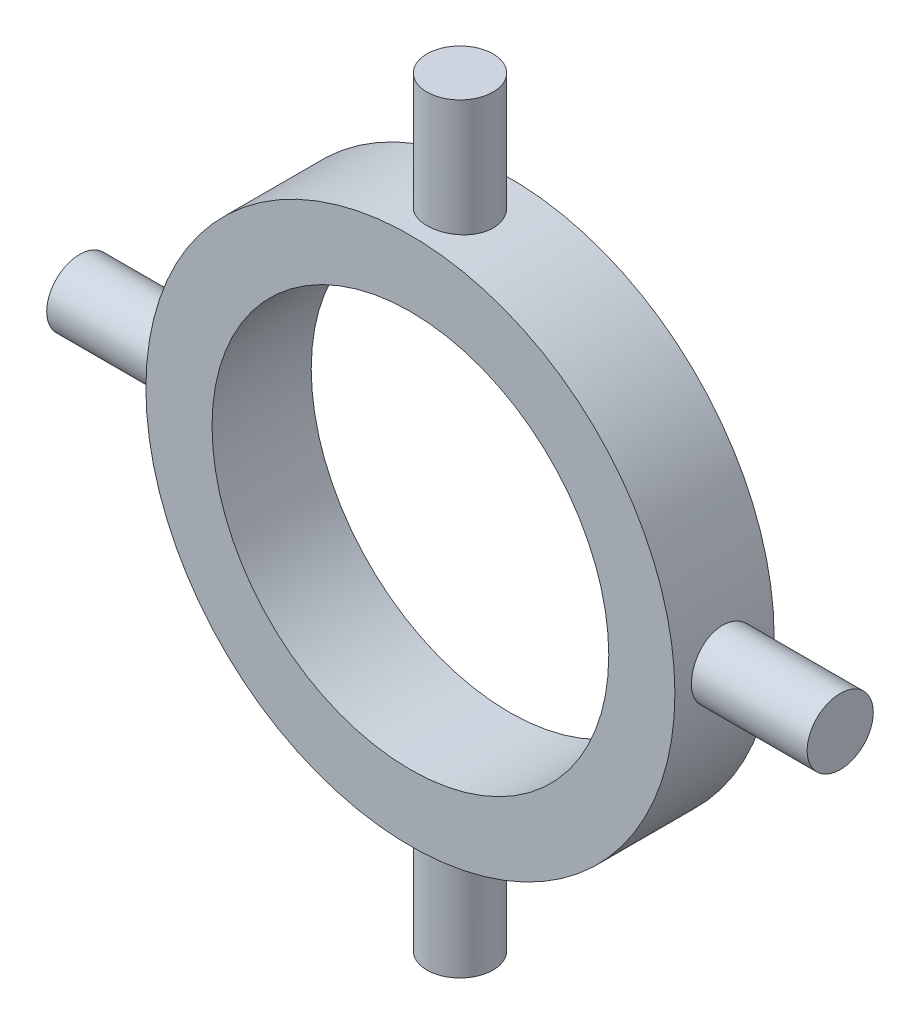
ISO-10303-21;
HEADER;
FILE_DESCRIPTION(('STEP AP214'),'2;1');
FILE_NAME('part.step','',(''),(''),'','','');
FILE_SCHEMA(('AUTOMOTIVE_DESIGN { 1 0 10303 214 1 1 1 1 }'));
ENDSEC;
DATA;
#1=APPLICATION_CONTEXT('core data for automotive mechanical design processes');
#2=APPLICATION_PROTOCOL_DEFINITION('international standard','automotive_design',2000,#1);
#3=PRODUCT_CONTEXT('',#1,'mechanical');
#4=PRODUCT('Part','Part','',(#3));
#5=PRODUCT_RELATED_PRODUCT_CATEGORY('part','',(#4));
#6=PRODUCT_DEFINITION_FORMATION('','',#4);
#7=PRODUCT_DEFINITION_CONTEXT('part definition',#1,'design');
#8=PRODUCT_DEFINITION('design','',#6,#7);
#9=PRODUCT_DEFINITION_SHAPE('','',#8);
#10=(LENGTH_UNIT() NAMED_UNIT(*) SI_UNIT(.MILLI.,.METRE.));
#11=(NAMED_UNIT(*) PLANE_ANGLE_UNIT() SI_UNIT($,.RADIAN.));
#12=(NAMED_UNIT(*) SI_UNIT($,.STERADIAN.) SOLID_ANGLE_UNIT());
#13=UNCERTAINTY_MEASURE_WITH_UNIT(LENGTH_MEASURE(1.E-05),#10,'distance_accuracy_value','');
#14=(GEOMETRIC_REPRESENTATION_CONTEXT(3) GLOBAL_UNCERTAINTY_ASSIGNED_CONTEXT((#13)) GLOBAL_UNIT_ASSIGNED_CONTEXT((#10,
#11,#12)) REPRESENTATION_CONTEXT('',''));
#15=CARTESIAN_POINT('',(0.,0.,0.));
#16=DIRECTION('',(0.,0.,1.));
#17=DIRECTION('',(1.,0.,0.));
#18=AXIS2_PLACEMENT_3D('',#15,#16,#17);
#19=CARTESIAN_POINT('',(0.,0.,7.5));
#20=DIRECTION('',(0.,0.,-1.));
#21=DIRECTION('',(-1.,0.,0.));
#22=AXIS2_PLACEMENT_3D('',#19,#20,#21);
#23=CYLINDRICAL_SURFACE('',#22,40.);
#24=CARTESIAN_POINT('',(40.,0.,5.));
#25=CARTESIAN_POINT('',(40.0000005381638,-0.139890119905128,5.00000160544363));
#26=CARTESIAN_POINT('',(39.9992647084955,-0.279756672055417,4.99412713053245));
#27=CARTESIAN_POINT('',(39.9963430990474,-0.558534146473231,4.97067434773429));
#28=CARTESIAN_POINT('',(39.9941569906199,-0.697444844924114,4.95309338703724));
#29=CARTESIAN_POINT('',(39.9883933720996,-0.973374569297787,4.90633674356431));
#30=CARTESIAN_POINT('',(39.984814825974,-1.11039210784,4.87715242704535));
#31=CARTESIAN_POINT('',(39.9763659190365,-1.3815095487987,4.80739331014042));
#32=CARTESIAN_POINT('',(39.9714950850908,-1.51560836311208,4.76681433761206));
#33=CARTESIAN_POINT('',(39.9606049872555,-1.77974867952927,4.67461680294956));
#34=CARTESIAN_POINT('',(39.9545869317721,-1.90979428479119,4.62300985008975));
#35=CARTESIAN_POINT('',(39.9415653040234,-2.16511159371551,4.50908421885045));
#36=CARTESIAN_POINT('',(39.9345613689602,-2.29038151829056,4.44676159528642));
#37=CARTESIAN_POINT('',(39.9197695937799,-2.53515746693697,4.31190117409457));
#38=CARTESIAN_POINT('',(39.9119821851605,-2.6546666106878,4.23936899068734));
#39=CARTESIAN_POINT('',(39.8958344174102,-2.8872111518514,4.0845478077838));
#40=CARTESIAN_POINT('',(39.8874738466497,-3.00024412947129,4.00225519615066));
#41=CARTESIAN_POINT('',(39.870376541653,-3.21950680684037,3.82811508199551));
#42=CARTESIAN_POINT('',(39.8616382696722,-3.32570323025801,3.73622582935142));
#43=CARTESIAN_POINT('',(39.8440638930874,-3.5300274197965,3.54381244367173));
#44=CARTESIAN_POINT('',(39.8352277534966,-3.62815218732704,3.44328512973081));
#45=CARTESIAN_POINT('',(39.8177127277211,-3.81557488779224,3.23435870872106));
#46=CARTESIAN_POINT('',(39.8090337926071,-3.90487560711768,3.12596210543272));
#47=CARTESIAN_POINT('',(39.7920724042628,-4.0740900049766,2.90198180305958));
#48=CARTESIAN_POINT('',(39.7837900984836,-4.15400020829435,2.78639546726841));
#49=CARTESIAN_POINT('',(39.767836590115,-4.30405460761974,2.54851867461022));
#50=CARTESIAN_POINT('',(39.7601672998988,-4.37416871629244,2.42620910452733));
#51=CARTESIAN_POINT('',(39.7456849515384,-4.50386359810217,2.17602320489505));
#52=CARTESIAN_POINT('',(39.7388722121988,-4.56344045265623,2.04814482636181));
#53=CARTESIAN_POINT('',(39.7263059358328,-4.6715723788149,1.7878085120806));
#54=CARTESIAN_POINT('',(39.7205519765303,-4.72013184632193,1.65535242721738));
#55=CARTESIAN_POINT('',(39.7102634489657,-4.80591459607029,1.38675855092581));
#56=CARTESIAN_POINT('',(39.7057293285926,-4.84313371513162,1.25061942733057));
#57=CARTESIAN_POINT('',(39.6942156965831,-4.9369446836796,0.839670275198614));
#58=CARTESIAN_POINT('',(39.689242054193,-4.97637915708478,0.560663990237947));
#59=CARTESIAN_POINT('',(39.6852781774936,-5.00788537091912,0.000104969119371298));
#60=CARTESIAN_POINT('',(39.6862877025679,-4.99995901599061,-0.281447664181033));
#61=CARTESIAN_POINT('',(39.6941397412189,-4.93723068067905,-0.837598360611085));
#62=CARTESIAN_POINT('',(39.7009489290566,-4.88269650974364,-1.11222694590207));
#63=CARTESIAN_POINT('',(39.7195838252991,-4.72870178261044,-1.64839306899775));
#64=CARTESIAN_POINT('',(39.7314096353432,-4.62924031615993,-1.90993034144568));
#65=CARTESIAN_POINT('',(39.7587823629902,-4.38793084641347,-2.41333518378111));
#66=CARTESIAN_POINT('',(39.7743394764765,-4.24596643413691,-2.65514638226273));
#67=CARTESIAN_POINT('',(39.8074142163638,-3.92376301219555,-3.11161360707172));
#68=CARTESIAN_POINT('',(39.8249319324209,-3.74352225186026,-3.32626839061148));
#69=CARTESIAN_POINT('',(39.8601022011236,-3.34839820167265,-3.72388536237577));
#70=CARTESIAN_POINT('',(39.8777548486259,-3.13328401036466,-3.90661816770982));
#71=CARTESIAN_POINT('',(39.9110926502289,-2.67531434354322,-4.23341777588328));
#72=CARTESIAN_POINT('',(39.9267777997928,-2.43245880406302,-4.3774844895628));
#73=CARTESIAN_POINT('',(39.954423044609,-1.92572334129996,-4.62286263670761));
#74=CARTESIAN_POINT('',(39.9663818880919,-1.66183639028543,-4.72415970671156));
#75=CARTESIAN_POINT('',(39.9852157155401,-1.12061588125209,-4.88094098809736));
#76=CARTESIAN_POINT('',(39.9920909375101,-0.843282953394362,-4.93642734425758));
#77=CARTESIAN_POINT('',(39.9999519282224,-0.285026327694849,-4.99971484853751));
#78=CARTESIAN_POINT('',(40.0009767228211,-0.00413898025519586,-5.00783198583042));
#79=CARTESIAN_POINT('',(39.9971267601402,0.554992072852983,-4.97698453078585));
#80=CARTESIAN_POINT('',(39.9922521284979,0.83323583469351,-4.93802094110426));
#81=CARTESIAN_POINT('',(39.9771753750007,1.37824901587752,-4.81438058682935));
#82=CARTESIAN_POINT('',(39.9669908157769,1.64505314244337,-4.72985448958341));
#83=CARTESIAN_POINT('',(39.9424344625044,2.16069930812281,-4.51764507978493));
#84=CARTESIAN_POINT('',(39.9280625262813,2.40954073698899,-4.38996030183751));
#85=CARTESIAN_POINT('',(39.8966364563238,2.88360904734714,-4.09429378648019));
#86=CARTESIAN_POINT('',(39.8795688738227,3.10870754222787,-3.92610765044467));
#87=CARTESIAN_POINT('',(39.8447028535409,3.52759395691152,-3.55450077486652));
#88=CARTESIAN_POINT('',(39.8269043867709,3.72138063328024,-3.35107863671943));
#89=CARTESIAN_POINT('',(39.7924620828694,4.07326400150426,-2.91338603015321));
#90=CARTESIAN_POINT('',(39.775825395705,4.23115123496745,-2.67894653919066));
#91=CARTESIAN_POINT('',(39.7457083194625,4.50530546506172,-2.18668027854392));
#92=CARTESIAN_POINT('',(39.7322278671136,4.62157329603301,-1.92885397782277));
#93=CARTESIAN_POINT('',(39.7099966403349,4.80885432607939,-1.39786139323798));
#94=CARTESIAN_POINT('',(39.7012335337284,4.87998560998222,-1.12473718803257));
#95=CARTESIAN_POINT('',(39.6893996880528,4.97533563287031,-0.570150186396651));
#96=CARTESIAN_POINT('',(39.686328684172,4.99955655425279,-0.288687778500497));
#97=CARTESIAN_POINT('',(39.686241386048,5.00021203982538,0.132294900316459));
#98=CARTESIAN_POINT('',(39.68695676783,4.99455342448889,0.272009225551819));
#99=CARTESIAN_POINT('',(39.6898435691377,4.97156759842692,0.550445504540787));
#100=CARTESIAN_POINT('',(39.6920144462689,4.95424473440731,0.68916780851851));
#101=CARTESIAN_POINT('',(39.6977533828976,4.90804527126818,0.964687038375647));
#102=CARTESIAN_POINT('',(39.7013219505368,4.87916447008386,1.1014832452479));
#103=CARTESIAN_POINT('',(39.7097514776595,4.81007786270748,1.3720937237412));
#104=CARTESIAN_POINT('',(39.7146119670106,4.76987617588932,1.50590906094575));
#105=CARTESIAN_POINT('',(39.7254873627674,4.67843682035607,1.76966440410947));
#106=CARTESIAN_POINT('',(39.731502265984,4.6271991821289,1.89960442077346));
#107=CARTESIAN_POINT('',(39.7445132115212,4.51407883701003,2.15465706308245));
#108=CARTESIAN_POINT('',(39.7515088975085,4.45219999438841,2.27977142100564));
#109=CARTESIAN_POINT('',(39.766288286481,4.3182008584531,2.5244006078898));
#110=CARTESIAN_POINT('',(39.7740722778211,4.24607681362515,2.64391336428205));
#111=CARTESIAN_POINT('',(39.7902044420045,4.09214062508192,2.87642448291324));
#112=CARTESIAN_POINT('',(39.7985524114375,4.01033196639699,2.98942516690357));
#113=CARTESIAN_POINT('',(39.8156417227917,3.83696646630907,3.20895432041371));
#114=CARTESIAN_POINT('',(39.8243854215878,3.74534501263952,3.31543158787401));
#115=CARTESIAN_POINT('',(39.8419606965952,3.55351080059086,3.52026178003775));
#116=CARTESIAN_POINT('',(39.8507922397986,3.45330116889781,3.61861763610109));
#117=CARTESIAN_POINT('',(39.8683029909288,3.24489676777311,3.80661935729718));
#118=CARTESIAN_POINT('',(39.8769821036513,3.13669721323718,3.8962599272414));
#119=CARTESIAN_POINT('',(39.8939349862933,2.91316118457661,4.06610237103271));
#120=CARTESIAN_POINT('',(39.9022089047575,2.79782736151177,4.14630771919458));
#121=CARTESIAN_POINT('',(39.9181553288822,2.56029300186372,4.29706521534259));
#122=CARTESIAN_POINT('',(39.925825172646,2.43806574742473,4.3675755588279));
#123=CARTESIAN_POINT('',(39.9403041894309,2.1880968873515,4.49801067551831));
#124=CARTESIAN_POINT('',(39.9471136779409,2.06035732624456,4.55793933220894));
#125=CARTESIAN_POINT('',(39.9596765836336,1.80032528471156,4.66676281985612));
#126=CARTESIAN_POINT('',(39.9654308239915,1.66803644956566,4.71566625822586));
#127=CARTESIAN_POINT('',(39.9757248289655,1.39980201837412,4.80212587715902));
#128=CARTESIAN_POINT('',(39.9802648800246,1.26385729314414,4.83968473432816));
#129=CARTESIAN_POINT('',(39.9893293227844,0.942088347754174,4.91409048578269));
#130=CARTESIAN_POINT('',(39.993314089932,0.755150897758069,4.94627339191876));
#131=CARTESIAN_POINT('',(39.9986490545576,0.378794555992436,4.9892269833987));
#132=CARTESIAN_POINT('',(39.999999271463,0.189375682531533,4.99999782663719));
#133=CARTESIAN_POINT('',(40.,0.,5.));
#134=B_SPLINE_CURVE_WITH_KNOTS('',3,(#24,#25,#26,#27,#28,#29,#30,#31,#32,#33,#34,#35,#36,#37,
#38,#39,#40,#41,#42,#43,#44,#45,#46,#47,#48,#49,#50,#51,#52,#53,#54,#55,#56,#57,#58,#59,#60,#61,
#62,#63,#64,#65,#66,#67,#68,#69,#70,#71,#72,#73,#74,#75,#76,#77,#78,#79,#80,#81,#82,#83,#84,#85,
#86,#87,#88,#89,#90,#91,#92,#93,#94,#95,#96,#97,#98,#99,#100,#101,#102,#103,#104,#105,#106,#107,
#108,#109,#110,#111,#112,#113,#114,#115,#116,#117,#118,#119,#120,#121,#122,#123,#124,#125,#126,
#127,#128,#129,#130,#131,#132,#133),.UNSPECIFIED.,.T.,.F.,(4,2,2,2,2,2,2,2,2,2,2,2,2,2,2,2,2,2,
2,2,2,2,2,2,2,2,2,2,2,2,2,2,2,2,2,2,2,2,2,2,2,2,2,2,2,2,2,2,2,2,2,2,2,2,4),(0.,
0.419504637823986,0.839104372080577,1.2590169051986,1.67908338982058,2.09870982539649,
2.51849108679867,2.93804240646985,3.35774948092479,3.77936522319641,4.20113689336971,
4.62277495120623,5.04456855951595,5.46763043530048,5.89084930960155,6.31389902278685,
6.73710385606696,7.57817257185724,8.4192074638241,9.25544199496467,10.0916934694557,
10.9302565918415,11.7688580764036,12.6132576288592,13.4576591283931,14.3023439807629,
15.1469892842064,15.9859936539693,16.8249801561694,17.6612091439987,18.4974665277098,
19.3380361246993,20.1786390936326,21.0240274962823,21.8693989505616,22.7125495517493,
23.5556609263433,23.9747450940195,24.3936731755013,24.8127537032622,25.2316819351986,
25.6506090098186,26.0693842743663,26.4883132802118,26.9070919891524,27.3288208308206,
27.7503967812448,28.1722272905917,28.5939019805889,29.0173414250536,29.4406251425127,
29.8635772481613,30.2864294856975,30.8543363757694,31.4222390780256),.UNSPECIFIED.);
#135=CARTESIAN_POINT('',(40.,0.,5.));
#136=VERTEX_POINT('',#135);
#137=EDGE_CURVE('E39',#136,#136,#134,.T.);
#138=ORIENTED_EDGE('',*,*,#137,.F.);
#139=EDGE_LOOP('',(#138));
#140=FACE_BOUND('',#139,.T.);
#141=CARTESIAN_POINT('',(0.,-40.,-5.));
#142=CARTESIAN_POINT('',(0.139890119905128,-40.0000005381638,-5.00000160544363));
#143=CARTESIAN_POINT('',(0.279756672055417,-39.9992647084955,-4.99412713053245));
#144=CARTESIAN_POINT('',(0.558534146473231,-39.9963430990474,-4.97067434773429));
#145=CARTESIAN_POINT('',(0.697444844924114,-39.9941569906199,-4.95309338703724));
#146=CARTESIAN_POINT('',(0.973374569297787,-39.9883933720996,-4.90633674356431));
#147=CARTESIAN_POINT('',(1.11039210784,-39.984814825974,-4.87715242704535));
#148=CARTESIAN_POINT('',(1.3815095487987,-39.9763659190365,-4.80739331014042));
#149=CARTESIAN_POINT('',(1.51560836311208,-39.9714950850908,-4.76681433761206));
#150=CARTESIAN_POINT('',(1.77974867952927,-39.9606049872555,-4.67461680294956));
#151=CARTESIAN_POINT('',(1.90979428479119,-39.9545869317721,-4.62300985008975));
#152=CARTESIAN_POINT('',(2.16511159371551,-39.9415653040234,-4.50908421885045));
#153=CARTESIAN_POINT('',(2.29038151829056,-39.9345613689602,-4.44676159528642));
#154=CARTESIAN_POINT('',(2.53515746693697,-39.9197695937799,-4.31190117409457));
#155=CARTESIAN_POINT('',(2.6546666106878,-39.9119821851605,-4.23936899068734));
#156=CARTESIAN_POINT('',(2.8872111518514,-39.8958344174102,-4.0845478077838));
#157=CARTESIAN_POINT('',(3.00024412947129,-39.8874738466497,-4.00225519615066));
#158=CARTESIAN_POINT('',(3.21950680684037,-39.870376541653,-3.82811508199551));
#159=CARTESIAN_POINT('',(3.32570323025801,-39.8616382696722,-3.73622582935142));
#160=CARTESIAN_POINT('',(3.5300274197965,-39.8440638930874,-3.54381244367173));
#161=CARTESIAN_POINT('',(3.62815218732704,-39.8352277534966,-3.44328512973081));
#162=CARTESIAN_POINT('',(3.81557488779224,-39.8177127277211,-3.23435870872106));
#163=CARTESIAN_POINT('',(3.90487560711768,-39.8090337926071,-3.12596210543272));
#164=CARTESIAN_POINT('',(4.0740900049766,-39.7920724042628,-2.90198180305958));
#165=CARTESIAN_POINT('',(4.15400020829435,-39.7837900984836,-2.78639546726841));
#166=CARTESIAN_POINT('',(4.30405460761974,-39.767836590115,-2.54851867461022));
#167=CARTESIAN_POINT('',(4.37416871629244,-39.7601672998988,-2.42620910452733));
#168=CARTESIAN_POINT('',(4.50386359810217,-39.7456849515384,-2.17602320489505));
#169=CARTESIAN_POINT('',(4.56344045265623,-39.7388722121988,-2.04814482636181));
#170=CARTESIAN_POINT('',(4.6715723788149,-39.7263059358328,-1.7878085120806));
#171=CARTESIAN_POINT('',(4.72013184632193,-39.7205519765303,-1.65535242721738));
#172=CARTESIAN_POINT('',(4.80591459607029,-39.7102634489657,-1.38675855092581));
#173=CARTESIAN_POINT('',(4.84313371513162,-39.7057293285926,-1.25061942733057));
#174=CARTESIAN_POINT('',(4.9369446836796,-39.6942156965831,-0.839670275198614));
#175=CARTESIAN_POINT('',(4.97637915708478,-39.689242054193,-0.560663990237947));
#176=CARTESIAN_POINT('',(5.00788537091912,-39.6852781774936,-0.000104969119371298));
#177=CARTESIAN_POINT('',(4.99995901599061,-39.6862877025679,0.281447664181033));
#178=CARTESIAN_POINT('',(4.93723068067905,-39.6941397412189,0.837598360611085));
#179=CARTESIAN_POINT('',(4.88269650974364,-39.7009489290566,1.11222694590207));
#180=CARTESIAN_POINT('',(4.72870178261044,-39.7195838252991,1.64839306899775));
#181=CARTESIAN_POINT('',(4.62924031615993,-39.7314096353432,1.90993034144568));
#182=CARTESIAN_POINT('',(4.38793084641347,-39.7587823629902,2.41333518378111));
#183=CARTESIAN_POINT('',(4.24596643413691,-39.7743394764765,2.65514638226273));
#184=CARTESIAN_POINT('',(3.92376301219555,-39.8074142163638,3.11161360707172));
#185=CARTESIAN_POINT('',(3.74352225186026,-39.8249319324209,3.32626839061148));
#186=CARTESIAN_POINT('',(3.34839820167265,-39.8601022011236,3.72388536237577));
#187=CARTESIAN_POINT('',(3.13328401036466,-39.8777548486259,3.90661816770982));
#188=CARTESIAN_POINT('',(2.67531434354322,-39.9110926502289,4.23341777588328));
#189=CARTESIAN_POINT('',(2.43245880406302,-39.9267777997928,4.3774844895628));
#190=CARTESIAN_POINT('',(1.92572334129996,-39.954423044609,4.62286263670761));
#191=CARTESIAN_POINT('',(1.66183639028543,-39.9663818880919,4.72415970671156));
#192=CARTESIAN_POINT('',(1.12061588125209,-39.9852157155401,4.88094098809736));
#193=CARTESIAN_POINT('',(0.843282953394362,-39.9920909375101,4.93642734425758));
#194=CARTESIAN_POINT('',(0.285026327694849,-39.9999519282224,4.99971484853751));
#195=CARTESIAN_POINT('',(0.00413898025519586,-40.0009767228211,5.00783198583042));
#196=CARTESIAN_POINT('',(-0.554992072852983,-39.9971267601402,4.97698453078585));
#197=CARTESIAN_POINT('',(-0.83323583469351,-39.9922521284979,4.93802094110426));
#198=CARTESIAN_POINT('',(-1.37824901587752,-39.9771753750007,4.81438058682935));
#199=CARTESIAN_POINT('',(-1.64505314244337,-39.9669908157769,4.72985448958341));
#200=CARTESIAN_POINT('',(-2.16069930812281,-39.9424344625044,4.51764507978493));
#201=CARTESIAN_POINT('',(-2.40954073698899,-39.9280625262813,4.38996030183751));
#202=CARTESIAN_POINT('',(-2.88360904734714,-39.8966364563238,4.09429378648019));
#203=CARTESIAN_POINT('',(-3.10870754222787,-39.8795688738227,3.92610765044467));
#204=CARTESIAN_POINT('',(-3.52759395691152,-39.8447028535409,3.55450077486652));
#205=CARTESIAN_POINT('',(-3.72138063328024,-39.8269043867709,3.35107863671943));
#206=CARTESIAN_POINT('',(-4.07326400150426,-39.7924620828694,2.91338603015321));
#207=CARTESIAN_POINT('',(-4.23115123496745,-39.775825395705,2.67894653919066));
#208=CARTESIAN_POINT('',(-4.50530546506172,-39.7457083194625,2.18668027854392));
#209=CARTESIAN_POINT('',(-4.62157329603301,-39.7322278671136,1.92885397782277));
#210=CARTESIAN_POINT('',(-4.80885432607939,-39.7099966403349,1.39786139323798));
#211=CARTESIAN_POINT('',(-4.87998560998222,-39.7012335337284,1.12473718803257));
#212=CARTESIAN_POINT('',(-4.97533563287031,-39.6893996880528,0.570150186396651));
#213=CARTESIAN_POINT('',(-4.99955655425279,-39.686328684172,0.288687778500497));
#214=CARTESIAN_POINT('',(-5.00021203982538,-39.686241386048,-0.132294900316459));
#215=CARTESIAN_POINT('',(-4.99455342448889,-39.68695676783,-0.272009225551819));
#216=CARTESIAN_POINT('',(-4.97156759842692,-39.6898435691377,-0.550445504540787));
#217=CARTESIAN_POINT('',(-4.95424473440731,-39.6920144462689,-0.68916780851851));
#218=CARTESIAN_POINT('',(-4.90804527126818,-39.6977533828976,-0.964687038375647));
#219=CARTESIAN_POINT('',(-4.87916447008386,-39.7013219505368,-1.1014832452479));
#220=CARTESIAN_POINT('',(-4.81007786270748,-39.7097514776595,-1.3720937237412));
#221=CARTESIAN_POINT('',(-4.76987617588932,-39.7146119670106,-1.50590906094575));
#222=CARTESIAN_POINT('',(-4.67843682035607,-39.7254873627674,-1.76966440410947));
#223=CARTESIAN_POINT('',(-4.6271991821289,-39.731502265984,-1.89960442077346));
#224=CARTESIAN_POINT('',(-4.51407883701003,-39.7445132115212,-2.15465706308245));
#225=CARTESIAN_POINT('',(-4.45219999438841,-39.7515088975085,-2.27977142100564));
#226=CARTESIAN_POINT('',(-4.3182008584531,-39.766288286481,-2.5244006078898));
#227=CARTESIAN_POINT('',(-4.24607681362515,-39.7740722778211,-2.64391336428205));
#228=CARTESIAN_POINT('',(-4.09214062508192,-39.7902044420045,-2.87642448291324));
#229=CARTESIAN_POINT('',(-4.01033196639699,-39.7985524114375,-2.98942516690357));
#230=CARTESIAN_POINT('',(-3.83696646630907,-39.8156417227917,-3.20895432041371));
#231=CARTESIAN_POINT('',(-3.74534501263952,-39.8243854215878,-3.31543158787401));
#232=CARTESIAN_POINT('',(-3.55351080059086,-39.8419606965952,-3.52026178003775));
#233=CARTESIAN_POINT('',(-3.45330116889781,-39.8507922397986,-3.61861763610109));
#234=CARTESIAN_POINT('',(-3.24489676777311,-39.8683029909288,-3.80661935729718));
#235=CARTESIAN_POINT('',(-3.13669721323718,-39.8769821036513,-3.8962599272414));
#236=CARTESIAN_POINT('',(-2.91316118457661,-39.8939349862933,-4.06610237103271));
#237=CARTESIAN_POINT('',(-2.79782736151177,-39.9022089047575,-4.14630771919458));
#238=CARTESIAN_POINT('',(-2.56029300186372,-39.9181553288822,-4.29706521534259));
#239=CARTESIAN_POINT('',(-2.43806574742473,-39.925825172646,-4.3675755588279));
#240=CARTESIAN_POINT('',(-2.1880968873515,-39.9403041894309,-4.49801067551831));
#241=CARTESIAN_POINT('',(-2.06035732624456,-39.9471136779409,-4.55793933220894));
#242=CARTESIAN_POINT('',(-1.80032528471156,-39.9596765836336,-4.66676281985612));
#243=CARTESIAN_POINT('',(-1.66803644956566,-39.9654308239915,-4.71566625822586));
#244=CARTESIAN_POINT('',(-1.39980201837412,-39.9757248289655,-4.80212587715902));
#245=CARTESIAN_POINT('',(-1.26385729314414,-39.9802648800246,-4.83968473432816));
#246=CARTESIAN_POINT('',(-0.942088347754174,-39.9893293227844,-4.91409048578269));
#247=CARTESIAN_POINT('',(-0.755150897758069,-39.993314089932,-4.94627339191876));
#248=CARTESIAN_POINT('',(-0.378794555992436,-39.9986490545576,-4.9892269833987));
#249=CARTESIAN_POINT('',(-0.189375682531533,-39.999999271463,-4.99999782663719));
#250=CARTESIAN_POINT('',(0.,-40.,-5.));
#251=B_SPLINE_CURVE_WITH_KNOTS('',3,(#141,#142,#143,#144,#145,#146,#147,#148,#149,#150,#151,
#152,#153,#154,#155,#156,#157,#158,#159,#160,#161,#162,#163,#164,#165,#166,#167,#168,#169,#170,
#171,#172,#173,#174,#175,#176,#177,#178,#179,#180,#181,#182,#183,#184,#185,#186,#187,#188,#189,
#190,#191,#192,#193,#194,#195,#196,#197,#198,#199,#200,#201,#202,#203,#204,#205,#206,#207,#208,
#209,#210,#211,#212,#213,#214,#215,#216,#217,#218,#219,#220,#221,#222,#223,#224,#225,#226,#227,
#228,#229,#230,#231,#232,#233,#234,#235,#236,#237,#238,#239,#240,#241,#242,#243,#244,#245,#246,
#247,#248,#249,#250),.UNSPECIFIED.,.T.,.F.,(4,2,2,2,2,2,2,2,2,2,2,2,2,2,2,2,2,2,2,2,2,2,2,2,2,2,
2,2,2,2,2,2,2,2,2,2,2,2,2,2,2,2,2,2,2,2,2,2,2,2,2,2,2,2,4),(0.,0.419504637823986,
0.839104372080577,1.2590169051986,1.67908338982058,2.09870982539649,2.51849108679867,
2.93804240646985,3.35774948092479,3.77936522319641,4.20113689336971,4.62277495120623,
5.04456855951595,5.46763043530048,5.89084930960155,6.31389902278685,6.73710385606696,
7.57817257185724,8.4192074638241,9.25544199496467,10.0916934694557,10.9302565918415,
11.7688580764036,12.6132576288592,13.4576591283931,14.3023439807629,15.1469892842064,
15.9859936539693,16.8249801561694,17.6612091439987,18.4974665277098,19.3380361246993,
20.1786390936326,21.0240274962823,21.8693989505616,22.7125495517493,23.5556609263433,
23.9747450940195,24.3936731755013,24.8127537032622,25.2316819351986,25.6506090098186,
26.0693842743663,26.4883132802118,26.9070919891524,27.3288208308206,27.7503967812448,
28.1722272905917,28.5939019805889,29.0173414250536,29.4406251425127,29.8635772481613,
30.2864294856975,30.8543363757694,31.4222390780256),.UNSPECIFIED.);
#252=CARTESIAN_POINT('',(0.,-40.,-5.));
#253=VERTEX_POINT('',#252);
#254=EDGE_CURVE('E89',#253,#253,#251,.T.);
#255=ORIENTED_EDGE('',*,*,#254,.F.);
#256=EDGE_LOOP('',(#255));
#257=FACE_BOUND('',#256,.T.);
#258=CARTESIAN_POINT('',(0.,0.,7.5));
#259=DIRECTION('',(0.,0.,1.));
#260=DIRECTION('',(1.,0.,0.));
#261=AXIS2_PLACEMENT_3D('',#258,#259,#260);
#262=CIRCLE('',#261,40.);
#263=CARTESIAN_POINT('',(40.,0.,7.5));
#264=VERTEX_POINT('',#263);
#265=EDGE_CURVE('E93',#264,#264,#262,.T.);
#266=ORIENTED_EDGE('',*,*,#265,.F.);
#267=EDGE_LOOP('',(#266));
#268=FACE_BOUND('',#267,.T.);
#269=CARTESIAN_POINT('',(0.,0.,-7.5));
#270=DIRECTION('',(0.,0.,1.));
#271=DIRECTION('',(1.,0.,0.));
#272=AXIS2_PLACEMENT_3D('',#269,#270,#271);
#273=CIRCLE('',#272,40.);
#274=CARTESIAN_POINT('',(40.,0.,-7.5));
#275=VERTEX_POINT('',#274);
#276=EDGE_CURVE('E35',#275,#275,#273,.T.);
#277=ORIENTED_EDGE('',*,*,#276,.T.);
#278=EDGE_LOOP('',(#277));
#279=FACE_BOUND('',#278,.T.);
#280=CARTESIAN_POINT('',(0.,40.,-5.));
#281=CARTESIAN_POINT('',(-0.139890119905128,40.0000005381638,-5.00000160544363));
#282=CARTESIAN_POINT('',(-0.279756672055417,39.9992647084955,-4.99412713053245));
#283=CARTESIAN_POINT('',(-0.558534146473231,39.9963430990474,-4.97067434773429));
#284=CARTESIAN_POINT('',(-0.697444844924114,39.9941569906199,-4.95309338703724));
#285=CARTESIAN_POINT('',(-0.973374569297787,39.9883933720996,-4.90633674356431));
#286=CARTESIAN_POINT('',(-1.11039210784,39.984814825974,-4.87715242704535));
#287=CARTESIAN_POINT('',(-1.3815095487987,39.9763659190365,-4.80739331014042));
#288=CARTESIAN_POINT('',(-1.51560836311208,39.9714950850908,-4.76681433761206));
#289=CARTESIAN_POINT('',(-1.77974867952927,39.9606049872555,-4.67461680294956));
#290=CARTESIAN_POINT('',(-1.90979428479119,39.9545869317721,-4.62300985008975));
#291=CARTESIAN_POINT('',(-2.16511159371551,39.9415653040234,-4.50908421885045));
#292=CARTESIAN_POINT('',(-2.29038151829056,39.9345613689602,-4.44676159528642));
#293=CARTESIAN_POINT('',(-2.53515746693697,39.9197695937799,-4.31190117409457));
#294=CARTESIAN_POINT('',(-2.6546666106878,39.9119821851605,-4.23936899068734));
#295=CARTESIAN_POINT('',(-2.8872111518514,39.8958344174102,-4.0845478077838));
#296=CARTESIAN_POINT('',(-3.00024412947129,39.8874738466497,-4.00225519615066));
#297=CARTESIAN_POINT('',(-3.21950680684037,39.870376541653,-3.82811508199551));
#298=CARTESIAN_POINT('',(-3.32570323025801,39.8616382696722,-3.73622582935142));
#299=CARTESIAN_POINT('',(-3.5300274197965,39.8440638930874,-3.54381244367173));
#300=CARTESIAN_POINT('',(-3.62815218732704,39.8352277534966,-3.44328512973081));
#301=CARTESIAN_POINT('',(-3.81557488779224,39.8177127277211,-3.23435870872106));
#302=CARTESIAN_POINT('',(-3.90487560711768,39.8090337926071,-3.12596210543272));
#303=CARTESIAN_POINT('',(-4.0740900049766,39.7920724042628,-2.90198180305958));
#304=CARTESIAN_POINT('',(-4.15400020829435,39.7837900984836,-2.78639546726841));
#305=CARTESIAN_POINT('',(-4.30405460761974,39.767836590115,-2.54851867461022));
#306=CARTESIAN_POINT('',(-4.37416871629244,39.7601672998988,-2.42620910452733));
#307=CARTESIAN_POINT('',(-4.50386359810217,39.7456849515384,-2.17602320489505));
#308=CARTESIAN_POINT('',(-4.56344045265623,39.7388722121988,-2.04814482636181));
#309=CARTESIAN_POINT('',(-4.6715723788149,39.7263059358328,-1.7878085120806));
#310=CARTESIAN_POINT('',(-4.72013184632193,39.7205519765303,-1.65535242721738));
#311=CARTESIAN_POINT('',(-4.80591459607029,39.7102634489657,-1.38675855092581));
#312=CARTESIAN_POINT('',(-4.84313371513162,39.7057293285926,-1.25061942733057));
#313=CARTESIAN_POINT('',(-4.9369446836796,39.6942156965831,-0.839670275198614));
#314=CARTESIAN_POINT('',(-4.97637915708478,39.689242054193,-0.560663990237947));
#315=CARTESIAN_POINT('',(-5.00788537091912,39.6852781774936,-0.000104969119371298));
#316=CARTESIAN_POINT('',(-4.99995901599061,39.6862877025679,0.281447664181033));
#317=CARTESIAN_POINT('',(-4.93723068067905,39.6941397412189,0.837598360611085));
#318=CARTESIAN_POINT('',(-4.88269650974364,39.7009489290566,1.11222694590207));
#319=CARTESIAN_POINT('',(-4.72870178261044,39.7195838252991,1.64839306899775));
#320=CARTESIAN_POINT('',(-4.62924031615993,39.7314096353432,1.90993034144568));
#321=CARTESIAN_POINT('',(-4.38793084641347,39.7587823629902,2.41333518378111));
#322=CARTESIAN_POINT('',(-4.24596643413691,39.7743394764765,2.65514638226273));
#323=CARTESIAN_POINT('',(-3.92376301219555,39.8074142163638,3.11161360707172));
#324=CARTESIAN_POINT('',(-3.74352225186026,39.8249319324209,3.32626839061148));
#325=CARTESIAN_POINT('',(-3.34839820167265,39.8601022011236,3.72388536237577));
#326=CARTESIAN_POINT('',(-3.13328401036466,39.8777548486259,3.90661816770982));
#327=CARTESIAN_POINT('',(-2.67531434354322,39.9110926502289,4.23341777588328));
#328=CARTESIAN_POINT('',(-2.43245880406302,39.9267777997928,4.3774844895628));
#329=CARTESIAN_POINT('',(-1.92572334129996,39.954423044609,4.62286263670761));
#330=CARTESIAN_POINT('',(-1.66183639028543,39.9663818880919,4.72415970671156));
#331=CARTESIAN_POINT('',(-1.12061588125209,39.9852157155401,4.88094098809736));
#332=CARTESIAN_POINT('',(-0.843282953394362,39.9920909375101,4.93642734425758));
#333=CARTESIAN_POINT('',(-0.285026327694849,39.9999519282224,4.99971484853751));
#334=CARTESIAN_POINT('',(-0.00413898025519586,40.0009767228211,5.00783198583042));
#335=CARTESIAN_POINT('',(0.554992072852983,39.9971267601402,4.97698453078585));
#336=CARTESIAN_POINT('',(0.83323583469351,39.9922521284979,4.93802094110426));
#337=CARTESIAN_POINT('',(1.37824901587752,39.9771753750007,4.81438058682935));
#338=CARTESIAN_POINT('',(1.64505314244337,39.9669908157769,4.72985448958341));
#339=CARTESIAN_POINT('',(2.16069930812281,39.9424344625044,4.51764507978493));
#340=CARTESIAN_POINT('',(2.40954073698899,39.9280625262813,4.38996030183751));
#341=CARTESIAN_POINT('',(2.88360904734714,39.8966364563238,4.09429378648019));
#342=CARTESIAN_POINT('',(3.10870754222787,39.8795688738227,3.92610765044467));
#343=CARTESIAN_POINT('',(3.52759395691152,39.8447028535409,3.55450077486652));
#344=CARTESIAN_POINT('',(3.72138063328024,39.8269043867709,3.35107863671943));
#345=CARTESIAN_POINT('',(4.07326400150426,39.7924620828694,2.91338603015321));
#346=CARTESIAN_POINT('',(4.23115123496745,39.775825395705,2.67894653919066));
#347=CARTESIAN_POINT('',(4.50530546506172,39.7457083194625,2.18668027854392));
#348=CARTESIAN_POINT('',(4.62157329603301,39.7322278671136,1.92885397782277));
#349=CARTESIAN_POINT('',(4.80885432607939,39.7099966403349,1.39786139323798));
#350=CARTESIAN_POINT('',(4.87998560998222,39.7012335337284,1.12473718803257));
#351=CARTESIAN_POINT('',(4.97533563287031,39.6893996880528,0.570150186396651));
#352=CARTESIAN_POINT('',(4.99955655425279,39.686328684172,0.288687778500497));
#353=CARTESIAN_POINT('',(5.00021203982538,39.686241386048,-0.132294900316459));
#354=CARTESIAN_POINT('',(4.99455342448889,39.68695676783,-0.272009225551819));
#355=CARTESIAN_POINT('',(4.97156759842692,39.6898435691377,-0.550445504540787));
#356=CARTESIAN_POINT('',(4.95424473440731,39.6920144462689,-0.68916780851851));
#357=CARTESIAN_POINT('',(4.90804527126818,39.6977533828976,-0.964687038375647));
#358=CARTESIAN_POINT('',(4.87916447008386,39.7013219505368,-1.1014832452479));
#359=CARTESIAN_POINT('',(4.81007786270748,39.7097514776595,-1.3720937237412));
#360=CARTESIAN_POINT('',(4.76987617588932,39.7146119670106,-1.50590906094575));
#361=CARTESIAN_POINT('',(4.67843682035607,39.7254873627674,-1.76966440410947));
#362=CARTESIAN_POINT('',(4.6271991821289,39.731502265984,-1.89960442077346));
#363=CARTESIAN_POINT('',(4.51407883701003,39.7445132115212,-2.15465706308245));
#364=CARTESIAN_POINT('',(4.45219999438841,39.7515088975085,-2.27977142100564));
#365=CARTESIAN_POINT('',(4.3182008584531,39.766288286481,-2.5244006078898));
#366=CARTESIAN_POINT('',(4.24607681362515,39.7740722778211,-2.64391336428205));
#367=CARTESIAN_POINT('',(4.09214062508192,39.7902044420045,-2.87642448291324));
#368=CARTESIAN_POINT('',(4.01033196639699,39.7985524114375,-2.98942516690357));
#369=CARTESIAN_POINT('',(3.83696646630907,39.8156417227917,-3.20895432041371));
#370=CARTESIAN_POINT('',(3.74534501263952,39.8243854215878,-3.31543158787401));
#371=CARTESIAN_POINT('',(3.55351080059086,39.8419606965952,-3.52026178003775));
#372=CARTESIAN_POINT('',(3.45330116889781,39.8507922397986,-3.61861763610109));
#373=CARTESIAN_POINT('',(3.24489676777311,39.8683029909288,-3.80661935729718));
#374=CARTESIAN_POINT('',(3.13669721323718,39.8769821036513,-3.8962599272414));
#375=CARTESIAN_POINT('',(2.91316118457661,39.8939349862933,-4.06610237103271));
#376=CARTESIAN_POINT('',(2.79782736151177,39.9022089047575,-4.14630771919458));
#377=CARTESIAN_POINT('',(2.56029300186372,39.9181553288822,-4.29706521534259));
#378=CARTESIAN_POINT('',(2.43806574742473,39.925825172646,-4.3675755588279));
#379=CARTESIAN_POINT('',(2.1880968873515,39.9403041894309,-4.49801067551831));
#380=CARTESIAN_POINT('',(2.06035732624456,39.9471136779409,-4.55793933220894));
#381=CARTESIAN_POINT('',(1.80032528471156,39.9596765836336,-4.66676281985612));
#382=CARTESIAN_POINT('',(1.66803644956566,39.9654308239915,-4.71566625822586));
#383=CARTESIAN_POINT('',(1.39980201837412,39.9757248289655,-4.80212587715902));
#384=CARTESIAN_POINT('',(1.26385729314414,39.9802648800246,-4.83968473432816));
#385=CARTESIAN_POINT('',(0.942088347754174,39.9893293227844,-4.91409048578269));
#386=CARTESIAN_POINT('',(0.755150897758069,39.993314089932,-4.94627339191876));
#387=CARTESIAN_POINT('',(0.378794555992436,39.9986490545576,-4.9892269833987));
#388=CARTESIAN_POINT('',(0.189375682531533,39.999999271463,-4.99999782663719));
#389=CARTESIAN_POINT('',(0.,40.,-5.));
#390=B_SPLINE_CURVE_WITH_KNOTS('',3,(#280,#281,#282,#283,#284,#285,#286,#287,#288,#289,#290,
#291,#292,#293,#294,#295,#296,#297,#298,#299,#300,#301,#302,#303,#304,#305,#306,#307,#308,#309,
#310,#311,#312,#313,#314,#315,#316,#317,#318,#319,#320,#321,#322,#323,#324,#325,#326,#327,#328,
#329,#330,#331,#332,#333,#334,#335,#336,#337,#338,#339,#340,#341,#342,#343,#344,#345,#346,#347,
#348,#349,#350,#351,#352,#353,#354,#355,#356,#357,#358,#359,#360,#361,#362,#363,#364,#365,#366,
#367,#368,#369,#370,#371,#372,#373,#374,#375,#376,#377,#378,#379,#380,#381,#382,#383,#384,#385,
#386,#387,#388,#389),.UNSPECIFIED.,.T.,.F.,(4,2,2,2,2,2,2,2,2,2,2,2,2,2,2,2,2,2,2,2,2,2,2,2,2,2,
2,2,2,2,2,2,2,2,2,2,2,2,2,2,2,2,2,2,2,2,2,2,2,2,2,2,2,2,4),(0.,0.419504637823986,
0.839104372080577,1.2590169051986,1.67908338982058,2.09870982539649,2.51849108679867,
2.93804240646985,3.35774948092479,3.77936522319641,4.20113689336971,4.62277495120623,
5.04456855951595,5.46763043530048,5.89084930960155,6.31389902278685,6.73710385606696,
7.57817257185724,8.4192074638241,9.25544199496467,10.0916934694557,10.9302565918415,
11.7688580764036,12.6132576288592,13.4576591283931,14.3023439807629,15.1469892842064,
15.9859936539693,16.8249801561694,17.6612091439987,18.4974665277098,19.3380361246993,
20.1786390936326,21.0240274962823,21.8693989505616,22.7125495517493,23.5556609263433,
23.9747450940195,24.3936731755013,24.8127537032622,25.2316819351986,25.6506090098186,
26.0693842743663,26.4883132802118,26.9070919891524,27.3288208308206,27.7503967812448,
28.1722272905917,28.5939019805889,29.0173414250536,29.4406251425127,29.8635772481613,
30.2864294856975,30.8543363757694,31.4222390780256),.UNSPECIFIED.);
#391=CARTESIAN_POINT('',(0.,40.,-5.));
#392=VERTEX_POINT('',#391);
#393=EDGE_CURVE('E44',#392,#392,#390,.T.);
#394=ORIENTED_EDGE('',*,*,#393,.F.);
#395=EDGE_LOOP('',(#394));
#396=FACE_BOUND('',#395,.T.);
#397=CARTESIAN_POINT('',(-40.,0.,5.));
#398=CARTESIAN_POINT('',(-40.0000005381638,0.139890119905128,5.00000160544363));
#399=CARTESIAN_POINT('',(-39.9992647084955,0.279756672055417,4.99412713053245));
#400=CARTESIAN_POINT('',(-39.9963430990474,0.558534146473231,4.97067434773429));
#401=CARTESIAN_POINT('',(-39.9941569906199,0.697444844924114,4.95309338703724));
#402=CARTESIAN_POINT('',(-39.9883933720996,0.973374569297787,4.90633674356431));
#403=CARTESIAN_POINT('',(-39.984814825974,1.11039210784,4.87715242704535));
#404=CARTESIAN_POINT('',(-39.9763659190365,1.3815095487987,4.80739331014042));
#405=CARTESIAN_POINT('',(-39.9714950850908,1.51560836311208,4.76681433761206));
#406=CARTESIAN_POINT('',(-39.9606049872555,1.77974867952927,4.67461680294956));
#407=CARTESIAN_POINT('',(-39.9545869317721,1.90979428479119,4.62300985008975));
#408=CARTESIAN_POINT('',(-39.9415653040234,2.16511159371551,4.50908421885045));
#409=CARTESIAN_POINT('',(-39.9345613689602,2.29038151829056,4.44676159528642));
#410=CARTESIAN_POINT('',(-39.9197695937799,2.53515746693697,4.31190117409457));
#411=CARTESIAN_POINT('',(-39.9119821851605,2.6546666106878,4.23936899068734));
#412=CARTESIAN_POINT('',(-39.8958344174102,2.8872111518514,4.0845478077838));
#413=CARTESIAN_POINT('',(-39.8874738466497,3.00024412947129,4.00225519615066));
#414=CARTESIAN_POINT('',(-39.870376541653,3.21950680684037,3.82811508199551));
#415=CARTESIAN_POINT('',(-39.8616382696722,3.32570323025801,3.73622582935142));
#416=CARTESIAN_POINT('',(-39.8440638930874,3.5300274197965,3.54381244367173));
#417=CARTESIAN_POINT('',(-39.8352277534966,3.62815218732704,3.44328512973081));
#418=CARTESIAN_POINT('',(-39.8177127277211,3.81557488779224,3.23435870872106));
#419=CARTESIAN_POINT('',(-39.8090337926071,3.90487560711768,3.12596210543272));
#420=CARTESIAN_POINT('',(-39.7920724042628,4.0740900049766,2.90198180305958));
#421=CARTESIAN_POINT('',(-39.7837900984836,4.15400020829435,2.78639546726841));
#422=CARTESIAN_POINT('',(-39.767836590115,4.30405460761974,2.54851867461022));
#423=CARTESIAN_POINT('',(-39.7601672998988,4.37416871629244,2.42620910452733));
#424=CARTESIAN_POINT('',(-39.7456849515384,4.50386359810217,2.17602320489505));
#425=CARTESIAN_POINT('',(-39.7388722121988,4.56344045265623,2.04814482636181));
#426=CARTESIAN_POINT('',(-39.7263059358328,4.6715723788149,1.7878085120806));
#427=CARTESIAN_POINT('',(-39.7205519765303,4.72013184632193,1.65535242721738));
#428=CARTESIAN_POINT('',(-39.7102634489657,4.80591459607029,1.38675855092581));
#429=CARTESIAN_POINT('',(-39.7057293285926,4.84313371513162,1.25061942733057));
#430=CARTESIAN_POINT('',(-39.6942156965831,4.9369446836796,0.839670275198614));
#431=CARTESIAN_POINT('',(-39.689242054193,4.97637915708478,0.560663990237947));
#432=CARTESIAN_POINT('',(-39.6852781774936,5.00788537091912,0.000104969119371298));
#433=CARTESIAN_POINT('',(-39.6862877025679,4.99995901599061,-0.281447664181033));
#434=CARTESIAN_POINT('',(-39.6941397412189,4.93723068067905,-0.837598360611085));
#435=CARTESIAN_POINT('',(-39.7009489290566,4.88269650974364,-1.11222694590207));
#436=CARTESIAN_POINT('',(-39.7195838252991,4.72870178261044,-1.64839306899775));
#437=CARTESIAN_POINT('',(-39.7314096353432,4.62924031615993,-1.90993034144568));
#438=CARTESIAN_POINT('',(-39.7587823629902,4.38793084641347,-2.41333518378111));
#439=CARTESIAN_POINT('',(-39.7743394764765,4.24596643413691,-2.65514638226273));
#440=CARTESIAN_POINT('',(-39.8074142163638,3.92376301219555,-3.11161360707172));
#441=CARTESIAN_POINT('',(-39.8249319324209,3.74352225186026,-3.32626839061148));
#442=CARTESIAN_POINT('',(-39.8601022011236,3.34839820167265,-3.72388536237577));
#443=CARTESIAN_POINT('',(-39.8777548486259,3.13328401036466,-3.90661816770982));
#444=CARTESIAN_POINT('',(-39.9110926502289,2.67531434354322,-4.23341777588328));
#445=CARTESIAN_POINT('',(-39.9267777997928,2.43245880406302,-4.3774844895628));
#446=CARTESIAN_POINT('',(-39.954423044609,1.92572334129996,-4.62286263670761));
#447=CARTESIAN_POINT('',(-39.9663818880919,1.66183639028543,-4.72415970671156));
#448=CARTESIAN_POINT('',(-39.9852157155401,1.12061588125209,-4.88094098809736));
#449=CARTESIAN_POINT('',(-39.9920909375101,0.843282953394362,-4.93642734425758));
#450=CARTESIAN_POINT('',(-39.9999519282224,0.285026327694849,-4.99971484853751));
#451=CARTESIAN_POINT('',(-40.0009767228211,0.00413898025519586,-5.00783198583042));
#452=CARTESIAN_POINT('',(-39.9971267601402,-0.554992072852983,-4.97698453078585));
#453=CARTESIAN_POINT('',(-39.9922521284979,-0.83323583469351,-4.93802094110426));
#454=CARTESIAN_POINT('',(-39.9771753750007,-1.37824901587752,-4.81438058682935));
#455=CARTESIAN_POINT('',(-39.9669908157769,-1.64505314244337,-4.72985448958341));
#456=CARTESIAN_POINT('',(-39.9424344625044,-2.16069930812281,-4.51764507978493));
#457=CARTESIAN_POINT('',(-39.9280625262813,-2.40954073698899,-4.38996030183751));
#458=CARTESIAN_POINT('',(-39.8966364563238,-2.88360904734714,-4.09429378648019));
#459=CARTESIAN_POINT('',(-39.8795688738227,-3.10870754222787,-3.92610765044467));
#460=CARTESIAN_POINT('',(-39.8447028535409,-3.52759395691152,-3.55450077486652));
#461=CARTESIAN_POINT('',(-39.8269043867709,-3.72138063328024,-3.35107863671943));
#462=CARTESIAN_POINT('',(-39.7924620828694,-4.07326400150426,-2.91338603015321));
#463=CARTESIAN_POINT('',(-39.775825395705,-4.23115123496745,-2.67894653919066));
#464=CARTESIAN_POINT('',(-39.7457083194625,-4.50530546506172,-2.18668027854392));
#465=CARTESIAN_POINT('',(-39.7322278671136,-4.62157329603301,-1.92885397782277));
#466=CARTESIAN_POINT('',(-39.7099966403349,-4.80885432607939,-1.39786139323798));
#467=CARTESIAN_POINT('',(-39.7012335337284,-4.87998560998222,-1.12473718803257));
#468=CARTESIAN_POINT('',(-39.6893996880528,-4.97533563287031,-0.570150186396651));
#469=CARTESIAN_POINT('',(-39.686328684172,-4.99955655425279,-0.288687778500497));
#470=CARTESIAN_POINT('',(-39.686241386048,-5.00021203982538,0.132294900316459));
#471=CARTESIAN_POINT('',(-39.68695676783,-4.99455342448889,0.272009225551819));
#472=CARTESIAN_POINT('',(-39.6898435691377,-4.97156759842692,0.550445504540787));
#473=CARTESIAN_POINT('',(-39.6920144462689,-4.95424473440731,0.68916780851851));
#474=CARTESIAN_POINT('',(-39.6977533828976,-4.90804527126818,0.964687038375647));
#475=CARTESIAN_POINT('',(-39.7013219505368,-4.87916447008386,1.1014832452479));
#476=CARTESIAN_POINT('',(-39.7097514776595,-4.81007786270748,1.3720937237412));
#477=CARTESIAN_POINT('',(-39.7146119670106,-4.76987617588932,1.50590906094575));
#478=CARTESIAN_POINT('',(-39.7254873627674,-4.67843682035607,1.76966440410947));
#479=CARTESIAN_POINT('',(-39.731502265984,-4.6271991821289,1.89960442077346));
#480=CARTESIAN_POINT('',(-39.7445132115212,-4.51407883701003,2.15465706308245));
#481=CARTESIAN_POINT('',(-39.7515088975085,-4.45219999438841,2.27977142100564));
#482=CARTESIAN_POINT('',(-39.766288286481,-4.3182008584531,2.5244006078898));
#483=CARTESIAN_POINT('',(-39.7740722778211,-4.24607681362515,2.64391336428205));
#484=CARTESIAN_POINT('',(-39.7902044420045,-4.09214062508192,2.87642448291324));
#485=CARTESIAN_POINT('',(-39.7985524114375,-4.01033196639699,2.98942516690357));
#486=CARTESIAN_POINT('',(-39.8156417227917,-3.83696646630907,3.20895432041371));
#487=CARTESIAN_POINT('',(-39.8243854215878,-3.74534501263952,3.31543158787401));
#488=CARTESIAN_POINT('',(-39.8419606965952,-3.55351080059086,3.52026178003775));
#489=CARTESIAN_POINT('',(-39.8507922397986,-3.45330116889781,3.61861763610109));
#490=CARTESIAN_POINT('',(-39.8683029909288,-3.24489676777311,3.80661935729718));
#491=CARTESIAN_POINT('',(-39.8769821036513,-3.13669721323718,3.8962599272414));
#492=CARTESIAN_POINT('',(-39.8939349862933,-2.91316118457661,4.06610237103271));
#493=CARTESIAN_POINT('',(-39.9022089047575,-2.79782736151177,4.14630771919458));
#494=CARTESIAN_POINT('',(-39.9181553288822,-2.56029300186372,4.29706521534259));
#495=CARTESIAN_POINT('',(-39.925825172646,-2.43806574742473,4.3675755588279));
#496=CARTESIAN_POINT('',(-39.9403041894309,-2.1880968873515,4.49801067551831));
#497=CARTESIAN_POINT('',(-39.9471136779409,-2.06035732624456,4.55793933220894));
#498=CARTESIAN_POINT('',(-39.9596765836336,-1.80032528471156,4.66676281985612));
#499=CARTESIAN_POINT('',(-39.9654308239915,-1.66803644956566,4.71566625822586));
#500=CARTESIAN_POINT('',(-39.9757248289655,-1.39980201837412,4.80212587715902));
#501=CARTESIAN_POINT('',(-39.9802648800246,-1.26385729314414,4.83968473432816));
#502=CARTESIAN_POINT('',(-39.9893293227844,-0.942088347754174,4.91409048578269));
#503=CARTESIAN_POINT('',(-39.993314089932,-0.755150897758069,4.94627339191876));
#504=CARTESIAN_POINT('',(-39.9986490545576,-0.378794555992436,4.9892269833987));
#505=CARTESIAN_POINT('',(-39.999999271463,-0.189375682531533,4.99999782663719));
#506=CARTESIAN_POINT('',(-40.,0.,5.));
#507=B_SPLINE_CURVE_WITH_KNOTS('',3,(#397,#398,#399,#400,#401,#402,#403,#404,#405,#406,#407,
#408,#409,#410,#411,#412,#413,#414,#415,#416,#417,#418,#419,#420,#421,#422,#423,#424,#425,#426,
#427,#428,#429,#430,#431,#432,#433,#434,#435,#436,#437,#438,#439,#440,#441,#442,#443,#444,#445,
#446,#447,#448,#449,#450,#451,#452,#453,#454,#455,#456,#457,#458,#459,#460,#461,#462,#463,#464,
#465,#466,#467,#468,#469,#470,#471,#472,#473,#474,#475,#476,#477,#478,#479,#480,#481,#482,#483,
#484,#485,#486,#487,#488,#489,#490,#491,#492,#493,#494,#495,#496,#497,#498,#499,#500,#501,#502,
#503,#504,#505,#506),.UNSPECIFIED.,.T.,.F.,(4,2,2,2,2,2,2,2,2,2,2,2,2,2,2,2,2,2,2,2,2,2,2,2,2,2,
2,2,2,2,2,2,2,2,2,2,2,2,2,2,2,2,2,2,2,2,2,2,2,2,2,2,2,2,4),(0.,0.419504637823986,
0.839104372080577,1.2590169051986,1.67908338982058,2.09870982539649,2.51849108679867,
2.93804240646985,3.35774948092479,3.77936522319641,4.20113689336971,4.62277495120623,
5.04456855951595,5.46763043530048,5.89084930960155,6.31389902278685,6.73710385606696,
7.57817257185724,8.4192074638241,9.25544199496467,10.0916934694557,10.9302565918415,
11.7688580764036,12.6132576288592,13.4576591283931,14.3023439807629,15.1469892842064,
15.9859936539693,16.8249801561694,17.6612091439987,18.4974665277098,19.3380361246993,
20.1786390936326,21.0240274962823,21.8693989505616,22.7125495517493,23.5556609263433,
23.9747450940195,24.3936731755013,24.8127537032622,25.2316819351986,25.6506090098186,
26.0693842743663,26.4883132802118,26.9070919891524,27.3288208308206,27.7503967812448,
28.1722272905917,28.5939019805889,29.0173414250536,29.4406251425127,29.8635772481613,
30.2864294856975,30.8543363757694,31.4222390780256),.UNSPECIFIED.);
#508=CARTESIAN_POINT('',(-40.,0.,5.));
#509=VERTEX_POINT('',#508);
#510=EDGE_CURVE('E10',#509,#509,#507,.T.);
#511=ORIENTED_EDGE('',*,*,#510,.F.);
#512=EDGE_LOOP('',(#511));
#513=FACE_BOUND('',#512,.T.);
#514=ADVANCED_FACE('F31',(#140,#257,#268,#279,#396,#513),#23,.T.);
#515=CARTESIAN_POINT('',(0.,0.,7.5));
#516=DIRECTION('',(0.,0.,-1.));
#517=DIRECTION('',(-1.,0.,0.));
#518=AXIS2_PLACEMENT_3D('',#515,#516,#517);
#519=CYLINDRICAL_SURFACE('',#518,30.);
#520=CARTESIAN_POINT('',(0.,0.,7.5));
#521=DIRECTION('',(0.,0.,1.));
#522=DIRECTION('',(1.,0.,0.));
#523=AXIS2_PLACEMENT_3D('',#520,#521,#522);
#524=CIRCLE('',#523,30.);
#525=CARTESIAN_POINT('',(30.,0.,7.5));
#526=VERTEX_POINT('',#525);
#527=EDGE_CURVE('E134',#526,#526,#524,.T.);
#528=ORIENTED_EDGE('',*,*,#527,.T.);
#529=EDGE_LOOP('',(#528));
#530=FACE_BOUND('',#529,.T.);
#531=CARTESIAN_POINT('',(0.,0.,-7.5));
#532=DIRECTION('',(0.,0.,1.));
#533=DIRECTION('',(1.,0.,0.));
#534=AXIS2_PLACEMENT_3D('',#531,#532,#533);
#535=CIRCLE('',#534,30.);
#536=CARTESIAN_POINT('',(30.,0.,-7.5));
#537=VERTEX_POINT('',#536);
#538=EDGE_CURVE('E100',#537,#537,#535,.T.);
#539=ORIENTED_EDGE('',*,*,#538,.F.);
#540=EDGE_LOOP('',(#539));
#541=FACE_BOUND('',#540,.T.);
#542=ADVANCED_FACE('F81',(#530,#541),#519,.F.);
#543=CARTESIAN_POINT('',(0.,0.,7.5));
#544=DIRECTION('',(0.,0.,1.));
#545=DIRECTION('',(1.,0.,0.));
#546=AXIS2_PLACEMENT_3D('',#543,#544,#545);
#547=PLANE('',#546);
#548=ORIENTED_EDGE('',*,*,#265,.T.);
#549=EDGE_LOOP('',(#548));
#550=FACE_BOUND('',#549,.T.);
#551=ORIENTED_EDGE('',*,*,#527,.F.);
#552=EDGE_LOOP('',(#551));
#553=FACE_BOUND('',#552,.T.);
#554=ADVANCED_FACE('F117',(#550,#553),#547,.T.);
#555=CARTESIAN_POINT('',(0.,0.,-7.5));
#556=DIRECTION('',(0.,0.,1.));
#557=DIRECTION('',(1.,0.,0.));
#558=AXIS2_PLACEMENT_3D('',#555,#556,#557);
#559=PLANE('',#558);
#560=ORIENTED_EDGE('',*,*,#276,.F.);
#561=EDGE_LOOP('',(#560));
#562=FACE_BOUND('',#561,.T.);
#563=ORIENTED_EDGE('',*,*,#538,.T.);
#564=EDGE_LOOP('',(#563));
#565=FACE_BOUND('',#564,.T.);
#566=ADVANCED_FACE('F75',(#562,#565),#559,.F.);
#567=CARTESIAN_POINT('',(0.,-57.5,0.));
#568=DIRECTION('',(0.,1.,0.));
#569=DIRECTION('',(0.,0.,1.));
#570=AXIS2_PLACEMENT_3D('',#567,#568,#569);
#571=PLANE('',#570);
#572=CARTESIAN_POINT('',(0.,-57.5,0.));
#573=DIRECTION('',(0.,1.,0.));
#574=DIRECTION('',(0.,0.,1.));
#575=AXIS2_PLACEMENT_3D('',#572,#573,#574);
#576=CIRCLE('',#575,5.);
#577=CARTESIAN_POINT('',(0.,-57.5,5.));
#578=VERTEX_POINT('',#577);
#579=EDGE_CURVE('E94',#578,#578,#576,.T.);
#580=ORIENTED_EDGE('',*,*,#579,.F.);
#581=EDGE_LOOP('',(#580));
#582=FACE_BOUND('',#581,.T.);
#583=ADVANCED_FACE('F71',(#582),#571,.F.);
#584=CARTESIAN_POINT('',(0.,57.5,0.));
#585=DIRECTION('',(0.,-1.,0.));
#586=DIRECTION('',(0.,0.,-1.));
#587=AXIS2_PLACEMENT_3D('',#584,#585,#586);
#588=CYLINDRICAL_SURFACE('',#587,5.);
#589=ORIENTED_EDGE('',*,*,#579,.T.);
#590=EDGE_LOOP('',(#589));
#591=FACE_BOUND('',#590,.T.);
#592=ORIENTED_EDGE('',*,*,#254,.T.);
#593=EDGE_LOOP('',(#592));
#594=FACE_BOUND('',#593,.T.);
#595=ADVANCED_FACE('F74',(#591,#594),#588,.T.);
#596=CARTESIAN_POINT('',(0.,57.5,0.));
#597=DIRECTION('',(0.,1.,0.));
#598=DIRECTION('',(0.,0.,1.));
#599=AXIS2_PLACEMENT_3D('',#596,#597,#598);
#600=CIRCLE('',#599,5.);
#601=CARTESIAN_POINT('',(0.,57.5,5.));
#602=VERTEX_POINT('',#601);
#603=EDGE_CURVE('E53',#602,#602,#600,.T.);
#604=ORIENTED_EDGE('',*,*,#603,.F.);
#605=EDGE_LOOP('',(#604));
#606=FACE_BOUND('',#605,.T.);
#607=ORIENTED_EDGE('',*,*,#393,.T.);
#608=EDGE_LOOP('',(#607));
#609=FACE_BOUND('',#608,.T.);
#610=ADVANCED_FACE('F69',(#606,#609),#588,.T.);
#611=CARTESIAN_POINT('',(0.,57.5,0.));
#612=DIRECTION('',(0.,1.,0.));
#613=DIRECTION('',(0.,0.,1.));
#614=AXIS2_PLACEMENT_3D('',#611,#612,#613);
#615=PLANE('',#614);
#616=ORIENTED_EDGE('',*,*,#603,.T.);
#617=EDGE_LOOP('',(#616));
#618=FACE_BOUND('',#617,.T.);
#619=ADVANCED_FACE('F64',(#618),#615,.T.);
#620=CARTESIAN_POINT('',(57.5,0.,0.));
#621=DIRECTION('',(1.,0.,0.));
#622=DIRECTION('',(0.,0.,-1.));
#623=AXIS2_PLACEMENT_3D('',#620,#621,#622);
#624=PLANE('',#623);
#625=CARTESIAN_POINT('',(57.5,0.,0.));
#626=DIRECTION('',(1.,0.,0.));
#627=DIRECTION('',(0.,0.,-1.));
#628=AXIS2_PLACEMENT_3D('',#625,#626,#627);
#629=CIRCLE('',#628,5.);
#630=CARTESIAN_POINT('',(57.5,0.,-5.));
#631=VERTEX_POINT('',#630);
#632=EDGE_CURVE('E96',#631,#631,#629,.T.);
#633=ORIENTED_EDGE('',*,*,#632,.T.);
#634=EDGE_LOOP('',(#633));
#635=FACE_BOUND('',#634,.T.);
#636=ADVANCED_FACE('F68',(#635),#624,.T.);
#637=CARTESIAN_POINT('',(57.5,0.,0.));
#638=DIRECTION('',(-1.,0.,0.));
#639=DIRECTION('',(0.,0.,1.));
#640=AXIS2_PLACEMENT_3D('',#637,#638,#639);
#641=CYLINDRICAL_SURFACE('',#640,5.);
#642=ORIENTED_EDGE('',*,*,#632,.F.);
#643=EDGE_LOOP('',(#642));
#644=FACE_BOUND('',#643,.T.);
#645=ORIENTED_EDGE('',*,*,#137,.T.);
#646=EDGE_LOOP('',(#645));
#647=FACE_BOUND('',#646,.T.);
#648=ADVANCED_FACE('F61',(#644,#647),#641,.T.);
#649=CARTESIAN_POINT('',(-57.5,0.,0.));
#650=DIRECTION('',(1.,0.,0.));
#651=DIRECTION('',(0.,0.,-1.));
#652=AXIS2_PLACEMENT_3D('',#649,#650,#651);
#653=CIRCLE('',#652,5.);
#654=CARTESIAN_POINT('',(-57.5,0.,-5.));
#655=VERTEX_POINT('',#654);
#656=EDGE_CURVE('E102',#655,#655,#653,.T.);
#657=ORIENTED_EDGE('',*,*,#656,.T.);
#658=EDGE_LOOP('',(#657));
#659=FACE_BOUND('',#658,.T.);
#660=ORIENTED_EDGE('',*,*,#510,.T.);
#661=EDGE_LOOP('',(#660));
#662=FACE_BOUND('',#661,.T.);
#663=ADVANCED_FACE('F55',(#659,#662),#641,.T.);
#664=CARTESIAN_POINT('',(-57.5,0.,0.));
#665=DIRECTION('',(1.,0.,0.));
#666=DIRECTION('',(0.,0.,-1.));
#667=AXIS2_PLACEMENT_3D('',#664,#665,#666);
#668=PLANE('',#667);
#669=ORIENTED_EDGE('',*,*,#656,.F.);
#670=EDGE_LOOP('',(#669));
#671=FACE_BOUND('',#670,.T.);
#672=ADVANCED_FACE('F60',(#671),#668,.F.);
#673=CLOSED_SHELL('',(#514,#542,#554,#566,#583,#595,#610,#619,#636,#648,#663,#672));
#674=MANIFOLD_SOLID_BREP('B2',#673);
#675=ADVANCED_BREP_SHAPE_REPRESENTATION('',(#18,#674),#14);
#676=SHAPE_DEFINITION_REPRESENTATION(#9,#675);
ENDSEC;
END-ISO-10303-21;
